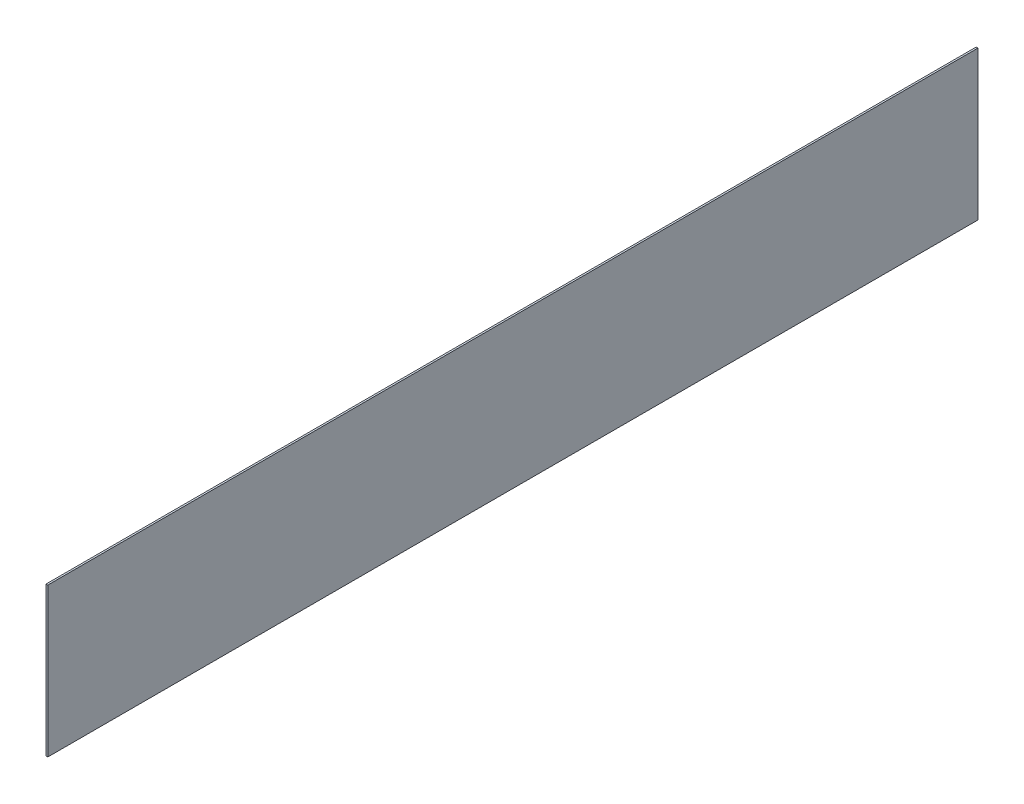
ISO-10303-21;
HEADER;
FILE_DESCRIPTION(('STEP AP214'),'2;1');
FILE_NAME('part.step','',(''),(''),'','','');
FILE_SCHEMA(('AUTOMOTIVE_DESIGN { 1 0 10303 214 1 1 1 1 }'));
ENDSEC;
DATA;
#1=APPLICATION_CONTEXT('core data for automotive mechanical design processes');
#2=APPLICATION_PROTOCOL_DEFINITION('international standard','automotive_design',2000,#1);
#3=PRODUCT_CONTEXT('',#1,'mechanical');
#4=PRODUCT('Part','Part','',(#3));
#5=PRODUCT_RELATED_PRODUCT_CATEGORY('part','',(#4));
#6=PRODUCT_DEFINITION_FORMATION('','',#4);
#7=PRODUCT_DEFINITION_CONTEXT('part definition',#1,'design');
#8=PRODUCT_DEFINITION('design','',#6,#7);
#9=PRODUCT_DEFINITION_SHAPE('','',#8);
#10=(LENGTH_UNIT() NAMED_UNIT(*) SI_UNIT(.MILLI.,.METRE.));
#11=(NAMED_UNIT(*) PLANE_ANGLE_UNIT() SI_UNIT($,.RADIAN.));
#12=(NAMED_UNIT(*) SI_UNIT($,.STERADIAN.) SOLID_ANGLE_UNIT());
#13=UNCERTAINTY_MEASURE_WITH_UNIT(LENGTH_MEASURE(1.E-05),#10,'distance_accuracy_value','');
#14=(GEOMETRIC_REPRESENTATION_CONTEXT(3) GLOBAL_UNCERTAINTY_ASSIGNED_CONTEXT((#13)) GLOBAL_UNIT_ASSIGNED_CONTEXT((#10,
#11,#12)) REPRESENTATION_CONTEXT('',''));
#15=CARTESIAN_POINT('',(0.,0.,0.));
#16=DIRECTION('',(0.,0.,1.));
#17=DIRECTION('',(1.,0.,0.));
#18=AXIS2_PLACEMENT_3D('',#15,#16,#17);
#19=CARTESIAN_POINT('',(1.5875,-66.07175,-412.75));
#20=DIRECTION('',(0.,0.,1.));
#21=DIRECTION('',(1.,0.,0.));
#22=AXIS2_PLACEMENT_3D('',#19,#20,#21);
#23=PLANE('',#22);
#24=DIRECTION('',(0.,1.,0.));
#25=VECTOR('',#24,1.);
#26=CARTESIAN_POINT('',(0.,-66.07175,-412.75));
#27=LINE('',#26,#25);
#28=CARTESIAN_POINT('',(0.,-66.07175,-412.75));
#29=VERTEX_POINT('',#28);
#30=CARTESIAN_POINT('',(0.,66.07175,-412.75));
#31=VERTEX_POINT('',#30);
#32=EDGE_CURVE('E98',#29,#31,#27,.T.);
#33=ORIENTED_EDGE('',*,*,#32,.T.);
#34=DIRECTION('',(-1.,0.,0.));
#35=VECTOR('',#34,1.);
#36=CARTESIAN_POINT('',(1.5875,66.07175,-412.75));
#37=LINE('',#36,#35);
#38=CARTESIAN_POINT('',(1.5875,66.07175,-412.75));
#39=VERTEX_POINT('',#38);
#40=EDGE_CURVE('E11',#39,#31,#37,.T.);
#41=ORIENTED_EDGE('',*,*,#40,.F.);
#42=DIRECTION('',(0.,1.,0.));
#43=VECTOR('',#42,1.);
#44=CARTESIAN_POINT('',(1.5875,-66.07175,-412.75));
#45=LINE('',#44,#43);
#46=CARTESIAN_POINT('',(1.5875,-66.07175,-412.75));
#47=VERTEX_POINT('',#46);
#48=EDGE_CURVE('E86',#47,#39,#45,.T.);
#49=ORIENTED_EDGE('',*,*,#48,.F.);
#50=DIRECTION('',(-1.,0.,0.));
#51=VECTOR('',#50,1.);
#52=CARTESIAN_POINT('',(1.5875,-66.07175,-412.75));
#53=LINE('',#52,#51);
#54=EDGE_CURVE('E94',#47,#29,#53,.T.);
#55=ORIENTED_EDGE('',*,*,#54,.T.);
#56=EDGE_LOOP('',(#33,#41,#49,#55));
#57=FACE_BOUND('',#56,.T.);
#58=ADVANCED_FACE('F35',(#57),#23,.F.);
#59=CARTESIAN_POINT('',(1.5875,66.07175,412.75));
#60=DIRECTION('',(0.,-1.,0.));
#61=DIRECTION('',(0.,0.,-1.));
#62=AXIS2_PLACEMENT_3D('',#59,#60,#61);
#63=PLANE('',#62);
#64=DIRECTION('',(0.,0.,1.));
#65=VECTOR('',#64,1.);
#66=CARTESIAN_POINT('',(0.,66.07175,412.75));
#67=LINE('',#66,#65);
#68=CARTESIAN_POINT('',(0.,66.07175,412.75));
#69=VERTEX_POINT('',#68);
#70=EDGE_CURVE('E90',#31,#69,#67,.T.);
#71=ORIENTED_EDGE('',*,*,#70,.T.);
#72=DIRECTION('',(-1.,0.,0.));
#73=VECTOR('',#72,1.);
#74=CARTESIAN_POINT('',(1.5875,66.07175,412.75));
#75=LINE('',#74,#73);
#76=CARTESIAN_POINT('',(1.5875,66.07175,412.75));
#77=VERTEX_POINT('',#76);
#78=EDGE_CURVE('E43',#77,#69,#75,.T.);
#79=ORIENTED_EDGE('',*,*,#78,.F.);
#80=DIRECTION('',(0.,0.,1.));
#81=VECTOR('',#80,1.);
#82=CARTESIAN_POINT('',(1.5875,66.07175,412.75));
#83=LINE('',#82,#81);
#84=EDGE_CURVE('E81',#39,#77,#83,.T.);
#85=ORIENTED_EDGE('',*,*,#84,.F.);
#86=ORIENTED_EDGE('',*,*,#40,.T.);
#87=EDGE_LOOP('',(#71,#79,#85,#86));
#88=FACE_BOUND('',#87,.T.);
#89=ADVANCED_FACE('F89',(#88),#63,.F.);
#90=CARTESIAN_POINT('',(1.5875,-66.07175,412.75));
#91=DIRECTION('',(0.,0.,-1.));
#92=DIRECTION('',(-1.,0.,0.));
#93=AXIS2_PLACEMENT_3D('',#90,#91,#92);
#94=PLANE('',#93);
#95=DIRECTION('',(0.,-1.,0.));
#96=VECTOR('',#95,1.);
#97=CARTESIAN_POINT('',(0.,-66.07175,412.75));
#98=LINE('',#97,#96);
#99=CARTESIAN_POINT('',(0.,-66.07175,412.75));
#100=VERTEX_POINT('',#99);
#101=EDGE_CURVE('E68',#69,#100,#98,.T.);
#102=ORIENTED_EDGE('',*,*,#101,.T.);
#103=DIRECTION('',(-1.,0.,0.));
#104=VECTOR('',#103,1.);
#105=CARTESIAN_POINT('',(1.5875,-66.07175,412.75));
#106=LINE('',#105,#104);
#107=CARTESIAN_POINT('',(1.5875,-66.07175,412.75));
#108=VERTEX_POINT('',#107);
#109=EDGE_CURVE('E91',#108,#100,#106,.T.);
#110=ORIENTED_EDGE('',*,*,#109,.F.);
#111=DIRECTION('',(0.,-1.,0.));
#112=VECTOR('',#111,1.);
#113=CARTESIAN_POINT('',(1.5875,-66.07175,412.75));
#114=LINE('',#113,#112);
#115=EDGE_CURVE('E84',#77,#108,#114,.T.);
#116=ORIENTED_EDGE('',*,*,#115,.F.);
#117=ORIENTED_EDGE('',*,*,#78,.T.);
#118=EDGE_LOOP('',(#102,#110,#116,#117));
#119=FACE_BOUND('',#118,.T.);
#120=ADVANCED_FACE('F92',(#119),#94,.F.);
#121=CARTESIAN_POINT('',(1.5875,-66.07175,412.75));
#122=DIRECTION('',(0.,1.,0.));
#123=DIRECTION('',(0.,0.,1.));
#124=AXIS2_PLACEMENT_3D('',#121,#122,#123);
#125=PLANE('',#124);
#126=DIRECTION('',(0.,0.,-1.));
#127=VECTOR('',#126,1.);
#128=CARTESIAN_POINT('',(0.,-66.07175,412.75));
#129=LINE('',#128,#127);
#130=EDGE_CURVE('E74',#100,#29,#129,.T.);
#131=ORIENTED_EDGE('',*,*,#130,.T.);
#132=ORIENTED_EDGE('',*,*,#54,.F.);
#133=DIRECTION('',(0.,0.,-1.));
#134=VECTOR('',#133,1.);
#135=CARTESIAN_POINT('',(1.5875,-66.07175,412.75));
#136=LINE('',#135,#134);
#137=EDGE_CURVE('E51',#108,#47,#136,.T.);
#138=ORIENTED_EDGE('',*,*,#137,.F.);
#139=ORIENTED_EDGE('',*,*,#109,.T.);
#140=EDGE_LOOP('',(#131,#132,#138,#139));
#141=FACE_BOUND('',#140,.T.);
#142=ADVANCED_FACE('F105',(#141),#125,.F.);
#143=CARTESIAN_POINT('',(1.5875,0.,0.));
#144=DIRECTION('',(-1.,0.,0.));
#145=DIRECTION('',(0.,0.,1.));
#146=AXIS2_PLACEMENT_3D('',#143,#144,#145);
#147=PLANE('',#146);
#148=ORIENTED_EDGE('',*,*,#48,.T.);
#149=ORIENTED_EDGE('',*,*,#84,.T.);
#150=ORIENTED_EDGE('',*,*,#115,.T.);
#151=ORIENTED_EDGE('',*,*,#137,.T.);
#152=EDGE_LOOP('',(#148,#149,#150,#151));
#153=FACE_BOUND('',#152,.T.);
#154=ADVANCED_FACE('F82',(#153),#147,.F.);
#155=CARTESIAN_POINT('',(0.,0.,0.));
#156=DIRECTION('',(-1.,0.,0.));
#157=DIRECTION('',(0.,0.,1.));
#158=AXIS2_PLACEMENT_3D('',#155,#156,#157);
#159=PLANE('',#158);
#160=ORIENTED_EDGE('',*,*,#32,.F.);
#161=ORIENTED_EDGE('',*,*,#130,.F.);
#162=ORIENTED_EDGE('',*,*,#101,.F.);
#163=ORIENTED_EDGE('',*,*,#70,.F.);
#164=EDGE_LOOP('',(#160,#161,#162,#163));
#165=FACE_BOUND('',#164,.T.);
#166=ADVANCED_FACE('F108',(#165),#159,.T.);
#167=CLOSED_SHELL('',(#58,#89,#120,#142,#154,#166));
#168=MANIFOLD_SOLID_BREP('B2',#167);
#169=ADVANCED_BREP_SHAPE_REPRESENTATION('',(#18,#168),#14);
#170=SHAPE_DEFINITION_REPRESENTATION(#9,#169);
ENDSEC;
END-ISO-10303-21;
